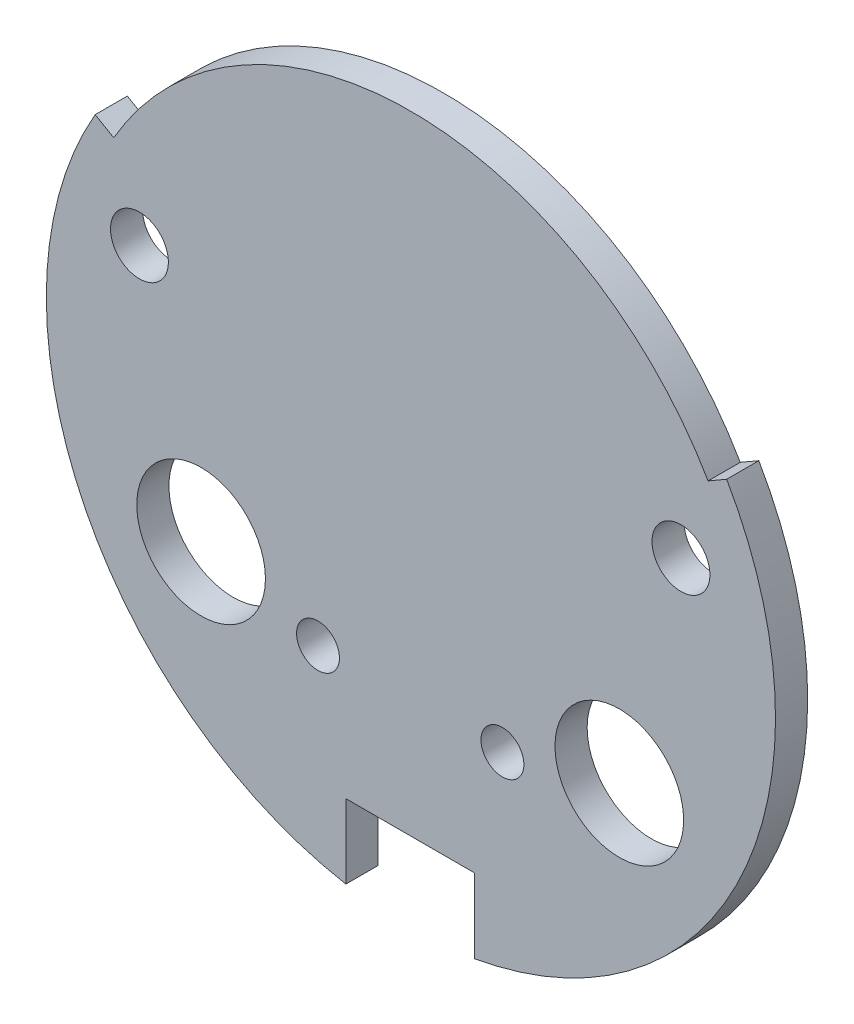
ISO-10303-21;
HEADER;
FILE_DESCRIPTION(('STEP AP214'),'2;1');
FILE_NAME('part.step','',(''),(''),'','','');
FILE_SCHEMA(('AUTOMOTIVE_DESIGN { 1 0 10303 214 1 1 1 1 }'));
ENDSEC;
DATA;
#1=APPLICATION_CONTEXT('core data for automotive mechanical design processes');
#2=APPLICATION_PROTOCOL_DEFINITION('international standard','automotive_design',2000,#1);
#3=PRODUCT_CONTEXT('',#1,'mechanical');
#4=PRODUCT('Part','Part','',(#3));
#5=PRODUCT_RELATED_PRODUCT_CATEGORY('part','',(#4));
#6=PRODUCT_DEFINITION_FORMATION('','',#4);
#7=PRODUCT_DEFINITION_CONTEXT('part definition',#1,'design');
#8=PRODUCT_DEFINITION('design','',#6,#7);
#9=PRODUCT_DEFINITION_SHAPE('','',#8);
#10=(LENGTH_UNIT() NAMED_UNIT(*) SI_UNIT(.MILLI.,.METRE.));
#11=(NAMED_UNIT(*) PLANE_ANGLE_UNIT() SI_UNIT($,.RADIAN.));
#12=(NAMED_UNIT(*) SI_UNIT($,.STERADIAN.) SOLID_ANGLE_UNIT());
#13=UNCERTAINTY_MEASURE_WITH_UNIT(LENGTH_MEASURE(1.E-05),#10,'distance_accuracy_value','');
#14=(GEOMETRIC_REPRESENTATION_CONTEXT(3) GLOBAL_UNCERTAINTY_ASSIGNED_CONTEXT((#13)) GLOBAL_UNIT_ASSIGNED_CONTEXT((#10,
#11,#12)) REPRESENTATION_CONTEXT('',''));
#15=CARTESIAN_POINT('',(0.,0.,0.));
#16=DIRECTION('',(0.,0.,1.));
#17=DIRECTION('',(1.,0.,0.));
#18=AXIS2_PLACEMENT_3D('',#15,#16,#17);
#19=CARTESIAN_POINT('',(2.64771409282375,-12.4645216723403,1.5));
#20=DIRECTION('',(1.,0.,0.));
#21=DIRECTION('',(0.,0.,-1.));
#22=AXIS2_PLACEMENT_3D('',#19,#20,#21);
#23=PLANE('',#22);
#24=DIRECTION('',(0.,-1.,0.));
#25=VECTOR('',#24,1.);
#26=CARTESIAN_POINT('',(2.64771409282375,-12.4645216723403,0.));
#27=LINE('',#26,#25);
#28=CARTESIAN_POINT('',(2.64771409282375,-12.4645216723403,0.));
#29=VERTEX_POINT('',#28);
#30=CARTESIAN_POINT('',(2.64771409282375,-15.9286503754711,0.));
#31=VERTEX_POINT('',#30);
#32=EDGE_CURVE('E131',#29,#31,#27,.T.);
#33=ORIENTED_EDGE('',*,*,#32,.T.);
#34=DIRECTION('',(0.,0.,-1.));
#35=VECTOR('',#34,1.);
#36=CARTESIAN_POINT('',(2.64771409282375,-15.9286503754711,1.5));
#37=LINE('',#36,#35);
#38=CARTESIAN_POINT('',(2.64771409282375,-15.9286503754711,1.5));
#39=VERTEX_POINT('',#38);
#40=EDGE_CURVE('E11',#39,#31,#37,.T.);
#41=ORIENTED_EDGE('',*,*,#40,.F.);
#42=DIRECTION('',(0.,-1.,0.));
#43=VECTOR('',#42,1.);
#44=CARTESIAN_POINT('',(2.64771409282375,-12.4645216723403,1.5));
#45=LINE('',#44,#43);
#46=CARTESIAN_POINT('',(2.64771409282375,-12.4645216723403,1.5));
#47=VERTEX_POINT('',#46);
#48=EDGE_CURVE('E146',#47,#39,#45,.T.);
#49=ORIENTED_EDGE('',*,*,#48,.F.);
#50=DIRECTION('',(0.,0.,-1.));
#51=VECTOR('',#50,1.);
#52=CARTESIAN_POINT('',(2.64771409282375,-12.4645216723403,1.5));
#53=LINE('',#52,#51);
#54=EDGE_CURVE('E127',#47,#29,#53,.T.);
#55=ORIENTED_EDGE('',*,*,#54,.T.);
#56=EDGE_LOOP('',(#33,#41,#49,#55));
#57=FACE_BOUND('',#56,.T.);
#58=ADVANCED_FACE('F35',(#57),#23,.F.);
#59=CARTESIAN_POINT('',(-0.319029957481509,0.810478327659741,1.5));
#60=DIRECTION('',(0.,0.,-1.));
#61=DIRECTION('',(-1.,0.,0.));
#62=AXIS2_PLACEMENT_3D('',#59,#60,#61);
#63=CYLINDRICAL_SURFACE('',#62,17.);
#64=CARTESIAN_POINT('',(-0.319029957481509,0.810478327659741,0.));
#65=DIRECTION('',(0.,0.,1.));
#66=DIRECTION('',(1.,0.,0.));
#67=AXIS2_PLACEMENT_3D('',#64,#65,#66);
#68=CIRCLE('',#67,17.);
#69=CARTESIAN_POINT('',(14.403401906854,9.31047832765971,0.));
#70=VERTEX_POINT('',#69);
#71=EDGE_CURVE('E134',#31,#70,#68,.T.);
#72=ORIENTED_EDGE('',*,*,#71,.T.);
#73=DIRECTION('',(0.,0.,-1.));
#74=VECTOR('',#73,1.);
#75=CARTESIAN_POINT('',(14.403401906854,9.31047832765971,1.5));
#76=LINE('',#75,#74);
#77=CARTESIAN_POINT('',(14.403401906854,9.31047832765971,1.5));
#78=VERTEX_POINT('',#77);
#79=EDGE_CURVE('E43',#78,#70,#76,.T.);
#80=ORIENTED_EDGE('',*,*,#79,.F.);
#81=CARTESIAN_POINT('',(-0.319029957481509,0.810478327659741,1.5));
#82=DIRECTION('',(0.,0.,1.));
#83=DIRECTION('',(1.,0.,0.));
#84=AXIS2_PLACEMENT_3D('',#81,#82,#83);
#85=CIRCLE('',#84,17.);
#86=EDGE_CURVE('E94',#39,#78,#85,.T.);
#87=ORIENTED_EDGE('',*,*,#86,.F.);
#88=ORIENTED_EDGE('',*,*,#40,.T.);
#89=EDGE_LOOP('',(#72,#80,#87,#88));
#90=FACE_BOUND('',#89,.T.);
#91=ADVANCED_FACE('F253',(#90),#63,.T.);
#92=CARTESIAN_POINT('',(14.403401906854,9.31047832765971,1.5));
#93=DIRECTION('',(0.499999999999997,-0.866025403784441,0.));
#94=DIRECTION('',(0.866025403784441,0.499999999999997,0.));
#95=AXIS2_PLACEMENT_3D('',#92,#93,#94);
#96=PLANE('',#95);
#97=DIRECTION('',(-0.86602540378444,-0.499999999999997,0.));
#98=VECTOR('',#97,1.);
#99=CARTESIAN_POINT('',(14.403401906854,9.31047832765971,0.));
#100=LINE('',#99,#98);
#101=CARTESIAN_POINT('',(13.5373765030695,8.81047832765971,0.));
#102=VERTEX_POINT('',#101);
#103=EDGE_CURVE('E137',#70,#102,#100,.T.);
#104=ORIENTED_EDGE('',*,*,#103,.T.);
#105=DIRECTION('',(0.,0.,-1.));
#106=VECTOR('',#105,1.);
#107=CARTESIAN_POINT('',(13.5373765030695,8.81047832765971,1.5));
#108=LINE('',#107,#106);
#109=CARTESIAN_POINT('',(13.5373765030695,8.81047832765971,1.5));
#110=VERTEX_POINT('',#109);
#111=EDGE_CURVE('E153',#110,#102,#108,.T.);
#112=ORIENTED_EDGE('',*,*,#111,.F.);
#113=DIRECTION('',(-0.86602540378444,-0.499999999999997,0.));
#114=VECTOR('',#113,1.);
#115=CARTESIAN_POINT('',(14.403401906854,9.31047832765971,1.5));
#116=LINE('',#115,#114);
#117=EDGE_CURVE('E161',#78,#110,#116,.T.);
#118=ORIENTED_EDGE('',*,*,#117,.F.);
#119=ORIENTED_EDGE('',*,*,#79,.T.);
#120=EDGE_LOOP('',(#104,#112,#118,#119));
#121=FACE_BOUND('',#120,.T.);
#122=ADVANCED_FACE('F159',(#121),#96,.F.);
#123=CARTESIAN_POINT('',(-0.319029957481509,0.810478327659741,1.5));
#124=DIRECTION('',(0.,0.,-1.));
#125=DIRECTION('',(-1.,0.,0.));
#126=AXIS2_PLACEMENT_3D('',#123,#124,#125);
#127=CYLINDRICAL_SURFACE('',#126,16.);
#128=CARTESIAN_POINT('',(-0.319029957481509,0.810478327659741,0.));
#129=DIRECTION('',(0.,0.,1.));
#130=DIRECTION('',(1.,0.,0.));
#131=AXIS2_PLACEMENT_3D('',#128,#129,#130);
#132=CIRCLE('',#131,16.);
#133=CARTESIAN_POINT('',(-14.1754364180326,8.8104783276597,0.));
#134=VERTEX_POINT('',#133);
#135=EDGE_CURVE('E139',#102,#134,#132,.T.);
#136=ORIENTED_EDGE('',*,*,#135,.T.);
#137=DIRECTION('',(0.,0.,-1.));
#138=VECTOR('',#137,1.);
#139=CARTESIAN_POINT('',(-14.1754364180326,8.8104783276597,1.5));
#140=LINE('',#139,#138);
#141=CARTESIAN_POINT('',(-14.1754364180326,8.8104783276597,1.5));
#142=VERTEX_POINT('',#141);
#143=EDGE_CURVE('E150',#142,#134,#140,.T.);
#144=ORIENTED_EDGE('',*,*,#143,.F.);
#145=CARTESIAN_POINT('',(-0.319029957481509,0.810478327659741,1.5));
#146=DIRECTION('',(0.,0.,1.));
#147=DIRECTION('',(1.,0.,0.));
#148=AXIS2_PLACEMENT_3D('',#145,#146,#147);
#149=CIRCLE('',#148,16.);
#150=EDGE_CURVE('E173',#110,#142,#149,.T.);
#151=ORIENTED_EDGE('',*,*,#150,.F.);
#152=ORIENTED_EDGE('',*,*,#111,.T.);
#153=EDGE_LOOP('',(#136,#144,#151,#152));
#154=FACE_BOUND('',#153,.T.);
#155=ADVANCED_FACE('F169',(#154),#127,.T.);
#156=CARTESIAN_POINT('',(-14.1754364180326,8.8104783276597,1.5));
#157=DIRECTION('',(-0.500000000000001,-0.866025403784438,0.));
#158=DIRECTION('',(0.866025403784438,-0.500000000000001,0.));
#159=AXIS2_PLACEMENT_3D('',#156,#157,#158);
#160=PLANE('',#159);
#161=DIRECTION('',(-0.866025403784438,0.500000000000001,0.));
#162=VECTOR('',#161,1.);
#163=CARTESIAN_POINT('',(-14.1754364180326,8.8104783276597,0.));
#164=LINE('',#163,#162);
#165=CARTESIAN_POINT('',(-15.041461821817,9.3104783276597,0.));
#166=VERTEX_POINT('',#165);
#167=EDGE_CURVE('E141',#134,#166,#164,.T.);
#168=ORIENTED_EDGE('',*,*,#167,.T.);
#169=DIRECTION('',(0.,0.,-1.));
#170=VECTOR('',#169,1.);
#171=CARTESIAN_POINT('',(-15.041461821817,9.3104783276597,1.5));
#172=LINE('',#171,#170);
#173=CARTESIAN_POINT('',(-15.041461821817,9.3104783276597,1.5));
#174=VERTEX_POINT('',#173);
#175=EDGE_CURVE('E122',#174,#166,#172,.T.);
#176=ORIENTED_EDGE('',*,*,#175,.F.);
#177=DIRECTION('',(-0.866025403784438,0.500000000000001,0.));
#178=VECTOR('',#177,1.);
#179=CARTESIAN_POINT('',(-14.1754364180326,8.8104783276597,1.5));
#180=LINE('',#179,#178);
#181=EDGE_CURVE('E113',#142,#174,#180,.T.);
#182=ORIENTED_EDGE('',*,*,#181,.F.);
#183=ORIENTED_EDGE('',*,*,#143,.T.);
#184=EDGE_LOOP('',(#168,#176,#182,#183));
#185=FACE_BOUND('',#184,.T.);
#186=ADVANCED_FACE('F172',(#185),#160,.F.);
#187=CARTESIAN_POINT('',(-0.319029957481509,0.810478327659741,1.5));
#188=DIRECTION('',(0.,0.,-1.));
#189=DIRECTION('',(-1.,0.,0.));
#190=AXIS2_PLACEMENT_3D('',#187,#188,#189);
#191=CYLINDRICAL_SURFACE('',#190,17.);
#192=CARTESIAN_POINT('',(-0.319029957481509,0.810478327659741,0.));
#193=DIRECTION('',(0.,0.,1.));
#194=DIRECTION('',(1.,0.,0.));
#195=AXIS2_PLACEMENT_3D('',#192,#193,#194);
#196=CIRCLE('',#195,17.);
#197=CARTESIAN_POINT('',(-3.35228590717625,-15.9167258124122,0.));
#198=VERTEX_POINT('',#197);
#199=EDGE_CURVE('E121',#166,#198,#196,.T.);
#200=ORIENTED_EDGE('',*,*,#199,.T.);
#201=DIRECTION('',(0.,0.,-1.));
#202=VECTOR('',#201,1.);
#203=CARTESIAN_POINT('',(-3.35228590717625,-15.9167258124122,1.5));
#204=LINE('',#203,#202);
#205=CARTESIAN_POINT('',(-3.35228590717625,-15.9167258124122,1.5));
#206=VERTEX_POINT('',#205);
#207=EDGE_CURVE('E118',#206,#198,#204,.T.);
#208=ORIENTED_EDGE('',*,*,#207,.F.);
#209=CARTESIAN_POINT('',(-0.319029957481509,0.810478327659741,1.5));
#210=DIRECTION('',(0.,0.,1.));
#211=DIRECTION('',(1.,0.,0.));
#212=AXIS2_PLACEMENT_3D('',#209,#210,#211);
#213=CIRCLE('',#212,17.);
#214=EDGE_CURVE('E107',#174,#206,#213,.T.);
#215=ORIENTED_EDGE('',*,*,#214,.F.);
#216=ORIENTED_EDGE('',*,*,#175,.T.);
#217=EDGE_LOOP('',(#200,#208,#215,#216));
#218=FACE_BOUND('',#217,.T.);
#219=ADVANCED_FACE('F119',(#218),#191,.T.);
#220=CARTESIAN_POINT('',(-3.35228590717625,-12.4645216723403,1.5));
#221=DIRECTION('',(-1.,0.,0.));
#222=DIRECTION('',(0.,0.,1.));
#223=AXIS2_PLACEMENT_3D('',#220,#221,#222);
#224=PLANE('',#223);
#225=DIRECTION('',(0.,1.,0.));
#226=VECTOR('',#225,1.);
#227=CARTESIAN_POINT('',(-3.35228590717625,-12.4645216723403,0.));
#228=LINE('',#227,#226);
#229=CARTESIAN_POINT('',(-3.35228590717625,-12.4645216723403,0.));
#230=VERTEX_POINT('',#229);
#231=EDGE_CURVE('E80',#198,#230,#228,.T.);
#232=ORIENTED_EDGE('',*,*,#231,.T.);
#233=DIRECTION('',(0.,0.,-1.));
#234=VECTOR('',#233,1.);
#235=CARTESIAN_POINT('',(-3.35228590717625,-12.4645216723403,1.5));
#236=LINE('',#235,#234);
#237=CARTESIAN_POINT('',(-3.35228590717625,-12.4645216723403,1.5));
#238=VERTEX_POINT('',#237);
#239=EDGE_CURVE('E123',#238,#230,#236,.T.);
#240=ORIENTED_EDGE('',*,*,#239,.F.);
#241=DIRECTION('',(0.,1.,0.));
#242=VECTOR('',#241,1.);
#243=CARTESIAN_POINT('',(-3.35228590717625,-12.4645216723403,1.5));
#244=LINE('',#243,#242);
#245=EDGE_CURVE('E111',#206,#238,#244,.T.);
#246=ORIENTED_EDGE('',*,*,#245,.F.);
#247=ORIENTED_EDGE('',*,*,#207,.T.);
#248=EDGE_LOOP('',(#232,#240,#246,#247));
#249=FACE_BOUND('',#248,.T.);
#250=ADVANCED_FACE('F125',(#249),#224,.F.);
#251=CARTESIAN_POINT('',(-3.35228590717625,-12.4645216723403,1.5));
#252=DIRECTION('',(0.,1.,0.));
#253=DIRECTION('',(0.,0.,1.));
#254=AXIS2_PLACEMENT_3D('',#251,#252,#253);
#255=PLANE('',#254);
#256=DIRECTION('',(1.,0.,0.));
#257=VECTOR('',#256,1.);
#258=CARTESIAN_POINT('',(-3.35228590717625,-12.4645216723403,0.));
#259=LINE('',#258,#257);
#260=EDGE_CURVE('E86',#230,#29,#259,.T.);
#261=ORIENTED_EDGE('',*,*,#260,.T.);
#262=ORIENTED_EDGE('',*,*,#54,.F.);
#263=DIRECTION('',(1.,0.,0.));
#264=VECTOR('',#263,1.);
#265=CARTESIAN_POINT('',(-3.35228590717625,-12.4645216723403,1.5));
#266=LINE('',#265,#264);
#267=EDGE_CURVE('E51',#238,#47,#266,.T.);
#268=ORIENTED_EDGE('',*,*,#267,.F.);
#269=ORIENTED_EDGE('',*,*,#239,.T.);
#270=EDGE_LOOP('',(#261,#262,#268,#269));
#271=FACE_BOUND('',#270,.T.);
#272=ADVANCED_FACE('F226',(#271),#255,.F.);
#273=CARTESIAN_POINT('',(-0.319029957481509,0.810478327659741,1.5));
#274=DIRECTION('',(0.,0.,1.));
#275=DIRECTION('',(1.,0.,0.));
#276=AXIS2_PLACEMENT_3D('',#273,#274,#275);
#277=PLANE('',#276);
#278=CARTESIAN_POINT('',(3.94771409282375,-6.93952167234026,1.5));
#279=DIRECTION('',(0.,0.,1.));
#280=DIRECTION('',(-1.,0.,0.));
#281=AXIS2_PLACEMENT_3D('',#278,#279,#280);
#282=CIRCLE('',#281,1.);
#283=CARTESIAN_POINT('',(2.94771409282375,-6.93952167234026,1.5));
#284=VERTEX_POINT('',#283);
#285=EDGE_CURVE('E209',#284,#284,#282,.T.);
#286=ORIENTED_EDGE('',*,*,#285,.F.);
#287=EDGE_LOOP('',(#286));
#288=FACE_BOUND('',#287,.T.);
#289=CARTESIAN_POINT('',(-4.65228590717625,-6.93952167234026,1.5));
#290=DIRECTION('',(0.,0.,1.));
#291=DIRECTION('',(1.,0.,0.));
#292=AXIS2_PLACEMENT_3D('',#289,#290,#291);
#293=CIRCLE('',#292,1.);
#294=CARTESIAN_POINT('',(-3.65228590717625,-6.93952167234026,1.5));
#295=VERTEX_POINT('',#294);
#296=EDGE_CURVE('E203',#295,#295,#293,.T.);
#297=ORIENTED_EDGE('',*,*,#296,.F.);
#298=EDGE_LOOP('',(#297));
#299=FACE_BOUND('',#298,.T.);
#300=CARTESIAN_POINT('',(12.2727140928238,5.06047832765974,1.5));
#301=DIRECTION('',(0.,0.,1.));
#302=DIRECTION('',(-1.,0.,0.));
#303=AXIS2_PLACEMENT_3D('',#300,#301,#302);
#304=CIRCLE('',#303,1.35);
#305=CARTESIAN_POINT('',(10.9227140928238,5.06047832765974,1.5));
#306=VERTEX_POINT('',#305);
#307=EDGE_CURVE('E197',#306,#306,#304,.T.);
#308=ORIENTED_EDGE('',*,*,#307,.F.);
#309=EDGE_LOOP('',(#308));
#310=FACE_BOUND('',#309,.T.);
#311=CARTESIAN_POINT('',(-12.9772859071762,5.06047832765974,1.5));
#312=DIRECTION('',(0.,0.,1.));
#313=DIRECTION('',(1.,0.,0.));
#314=AXIS2_PLACEMENT_3D('',#311,#312,#313);
#315=CIRCLE('',#314,1.35);
#316=CARTESIAN_POINT('',(-11.6272859071762,5.06047832765974,1.5));
#317=VERTEX_POINT('',#316);
#318=EDGE_CURVE('E191',#317,#317,#315,.T.);
#319=ORIENTED_EDGE('',*,*,#318,.F.);
#320=EDGE_LOOP('',(#319));
#321=FACE_BOUND('',#320,.T.);
#322=CARTESIAN_POINT('',(9.39771409282375,-5.46452167234026,1.5));
#323=DIRECTION('',(0.,0.,1.));
#324=DIRECTION('',(-1.,0.,0.));
#325=AXIS2_PLACEMENT_3D('',#322,#323,#324);
#326=CIRCLE('',#325,3.);
#327=CARTESIAN_POINT('',(6.39771409282375,-5.46452167234026,1.5));
#328=VERTEX_POINT('',#327);
#329=EDGE_CURVE('E185',#328,#328,#326,.T.);
#330=ORIENTED_EDGE('',*,*,#329,.F.);
#331=EDGE_LOOP('',(#330));
#332=FACE_BOUND('',#331,.T.);
#333=CARTESIAN_POINT('',(-10.1022859071762,-5.46452167234026,1.5));
#334=DIRECTION('',(0.,0.,1.));
#335=DIRECTION('',(1.,0.,0.));
#336=AXIS2_PLACEMENT_3D('',#333,#334,#335);
#337=CIRCLE('',#336,3.);
#338=CARTESIAN_POINT('',(-7.10228590717625,-5.46452167234026,1.5));
#339=VERTEX_POINT('',#338);
#340=EDGE_CURVE('E179',#339,#339,#337,.T.);
#341=ORIENTED_EDGE('',*,*,#340,.F.);
#342=EDGE_LOOP('',(#341));
#343=FACE_BOUND('',#342,.T.);
#344=ORIENTED_EDGE('',*,*,#48,.T.);
#345=ORIENTED_EDGE('',*,*,#86,.T.);
#346=ORIENTED_EDGE('',*,*,#117,.T.);
#347=ORIENTED_EDGE('',*,*,#150,.T.);
#348=ORIENTED_EDGE('',*,*,#181,.T.);
#349=ORIENTED_EDGE('',*,*,#214,.T.);
#350=ORIENTED_EDGE('',*,*,#245,.T.);
#351=ORIENTED_EDGE('',*,*,#267,.T.);
#352=EDGE_LOOP('',(#344,#345,#346,#347,#348,#349,#350,#351));
#353=FACE_BOUND('',#352,.T.);
#354=ADVANCED_FACE('F109',(#288,#299,#310,#321,#332,#343,#353),#277,.T.);
#355=CARTESIAN_POINT('',(-0.319029957481509,0.810478327659741,0.));
#356=DIRECTION('',(0.,0.,1.));
#357=DIRECTION('',(1.,0.,0.));
#358=AXIS2_PLACEMENT_3D('',#355,#356,#357);
#359=PLANE('',#358);
#360=CARTESIAN_POINT('',(3.94771409282375,-6.93952167234026,0.));
#361=DIRECTION('',(0.,0.,1.));
#362=DIRECTION('',(-1.,0.,0.));
#363=AXIS2_PLACEMENT_3D('',#360,#361,#362);
#364=CIRCLE('',#363,1.);
#365=CARTESIAN_POINT('',(2.94771409282375,-6.93952167234026,0.));
#366=VERTEX_POINT('',#365);
#367=EDGE_CURVE('E206',#366,#366,#364,.T.);
#368=ORIENTED_EDGE('',*,*,#367,.T.);
#369=EDGE_LOOP('',(#368));
#370=FACE_BOUND('',#369,.T.);
#371=CARTESIAN_POINT('',(-4.65228590717625,-6.93952167234026,0.));
#372=DIRECTION('',(0.,0.,1.));
#373=DIRECTION('',(1.,0.,0.));
#374=AXIS2_PLACEMENT_3D('',#371,#372,#373);
#375=CIRCLE('',#374,1.);
#376=CARTESIAN_POINT('',(-3.65228590717625,-6.93952167234026,0.));
#377=VERTEX_POINT('',#376);
#378=EDGE_CURVE('E200',#377,#377,#375,.T.);
#379=ORIENTED_EDGE('',*,*,#378,.T.);
#380=EDGE_LOOP('',(#379));
#381=FACE_BOUND('',#380,.T.);
#382=CARTESIAN_POINT('',(12.2727140928238,5.06047832765974,0.));
#383=DIRECTION('',(0.,0.,1.));
#384=DIRECTION('',(-1.,0.,0.));
#385=AXIS2_PLACEMENT_3D('',#382,#383,#384);
#386=CIRCLE('',#385,1.35);
#387=CARTESIAN_POINT('',(10.9227140928238,5.06047832765974,0.));
#388=VERTEX_POINT('',#387);
#389=EDGE_CURVE('E194',#388,#388,#386,.T.);
#390=ORIENTED_EDGE('',*,*,#389,.T.);
#391=EDGE_LOOP('',(#390));
#392=FACE_BOUND('',#391,.T.);
#393=CARTESIAN_POINT('',(-12.9772859071762,5.06047832765974,0.));
#394=DIRECTION('',(0.,0.,1.));
#395=DIRECTION('',(1.,0.,0.));
#396=AXIS2_PLACEMENT_3D('',#393,#394,#395);
#397=CIRCLE('',#396,1.35);
#398=CARTESIAN_POINT('',(-11.6272859071762,5.06047832765974,0.));
#399=VERTEX_POINT('',#398);
#400=EDGE_CURVE('E188',#399,#399,#397,.T.);
#401=ORIENTED_EDGE('',*,*,#400,.T.);
#402=EDGE_LOOP('',(#401));
#403=FACE_BOUND('',#402,.T.);
#404=CARTESIAN_POINT('',(9.39771409282375,-5.46452167234026,0.));
#405=DIRECTION('',(0.,0.,1.));
#406=DIRECTION('',(-1.,0.,0.));
#407=AXIS2_PLACEMENT_3D('',#404,#405,#406);
#408=CIRCLE('',#407,3.);
#409=CARTESIAN_POINT('',(6.39771409282375,-5.46452167234026,0.));
#410=VERTEX_POINT('',#409);
#411=EDGE_CURVE('E182',#410,#410,#408,.T.);
#412=ORIENTED_EDGE('',*,*,#411,.T.);
#413=EDGE_LOOP('',(#412));
#414=FACE_BOUND('',#413,.T.);
#415=CARTESIAN_POINT('',(-10.1022859071762,-5.46452167234026,0.));
#416=DIRECTION('',(0.,0.,1.));
#417=DIRECTION('',(1.,0.,0.));
#418=AXIS2_PLACEMENT_3D('',#415,#416,#417);
#419=CIRCLE('',#418,3.);
#420=CARTESIAN_POINT('',(-7.10228590717625,-5.46452167234026,0.));
#421=VERTEX_POINT('',#420);
#422=EDGE_CURVE('E135',#421,#421,#419,.T.);
#423=ORIENTED_EDGE('',*,*,#422,.T.);
#424=EDGE_LOOP('',(#423));
#425=FACE_BOUND('',#424,.T.);
#426=ORIENTED_EDGE('',*,*,#32,.F.);
#427=ORIENTED_EDGE('',*,*,#260,.F.);
#428=ORIENTED_EDGE('',*,*,#231,.F.);
#429=ORIENTED_EDGE('',*,*,#199,.F.);
#430=ORIENTED_EDGE('',*,*,#167,.F.);
#431=ORIENTED_EDGE('',*,*,#135,.F.);
#432=ORIENTED_EDGE('',*,*,#103,.F.);
#433=ORIENTED_EDGE('',*,*,#71,.F.);
#434=EDGE_LOOP('',(#426,#427,#428,#429,#430,#431,#432,#433));
#435=FACE_BOUND('',#434,.T.);
#436=ADVANCED_FACE('F165',(#370,#381,#392,#403,#414,#425,#435),#359,.F.);
#437=CARTESIAN_POINT('',(-10.1022859071762,-5.46452167234026,0.));
#438=DIRECTION('',(0.,0.,1.));
#439=DIRECTION('',(1.,0.,0.));
#440=AXIS2_PLACEMENT_3D('',#437,#438,#439);
#441=CYLINDRICAL_SURFACE('',#440,3.);
#442=ORIENTED_EDGE('',*,*,#422,.F.);
#443=EDGE_LOOP('',(#442));
#444=FACE_BOUND('',#443,.T.);
#445=ORIENTED_EDGE('',*,*,#340,.T.);
#446=EDGE_LOOP('',(#445));
#447=FACE_BOUND('',#446,.T.);
#448=ADVANCED_FACE('F238',(#444,#447),#441,.F.);
#449=CARTESIAN_POINT('',(9.39771409282375,-5.46452167234026,0.));
#450=DIRECTION('',(0.,0.,1.));
#451=DIRECTION('',(1.,0.,0.));
#452=AXIS2_PLACEMENT_3D('',#449,#450,#451);
#453=CYLINDRICAL_SURFACE('',#452,3.);
#454=ORIENTED_EDGE('',*,*,#411,.F.);
#455=EDGE_LOOP('',(#454));
#456=FACE_BOUND('',#455,.T.);
#457=ORIENTED_EDGE('',*,*,#329,.T.);
#458=EDGE_LOOP('',(#457));
#459=FACE_BOUND('',#458,.T.);
#460=ADVANCED_FACE('F240',(#456,#459),#453,.F.);
#461=CARTESIAN_POINT('',(-12.9772859071762,5.06047832765974,0.));
#462=DIRECTION('',(0.,0.,1.));
#463=DIRECTION('',(1.,0.,0.));
#464=AXIS2_PLACEMENT_3D('',#461,#462,#463);
#465=CYLINDRICAL_SURFACE('',#464,1.35);
#466=ORIENTED_EDGE('',*,*,#400,.F.);
#467=EDGE_LOOP('',(#466));
#468=FACE_BOUND('',#467,.T.);
#469=ORIENTED_EDGE('',*,*,#318,.T.);
#470=EDGE_LOOP('',(#469));
#471=FACE_BOUND('',#470,.T.);
#472=ADVANCED_FACE('F247',(#468,#471),#465,.F.);
#473=CARTESIAN_POINT('',(12.2727140928238,5.06047832765974,0.));
#474=DIRECTION('',(0.,0.,1.));
#475=DIRECTION('',(1.,0.,0.));
#476=AXIS2_PLACEMENT_3D('',#473,#474,#475);
#477=CYLINDRICAL_SURFACE('',#476,1.35);
#478=ORIENTED_EDGE('',*,*,#389,.F.);
#479=EDGE_LOOP('',(#478));
#480=FACE_BOUND('',#479,.T.);
#481=ORIENTED_EDGE('',*,*,#307,.T.);
#482=EDGE_LOOP('',(#481));
#483=FACE_BOUND('',#482,.T.);
#484=ADVANCED_FACE('F329',(#480,#483),#477,.F.);
#485=CARTESIAN_POINT('',(-4.65228590717625,-6.93952167234026,0.));
#486=DIRECTION('',(0.,0.,1.));
#487=DIRECTION('',(1.,0.,0.));
#488=AXIS2_PLACEMENT_3D('',#485,#486,#487);
#489=CYLINDRICAL_SURFACE('',#488,1.);
#490=ORIENTED_EDGE('',*,*,#378,.F.);
#491=EDGE_LOOP('',(#490));
#492=FACE_BOUND('',#491,.T.);
#493=ORIENTED_EDGE('',*,*,#296,.T.);
#494=EDGE_LOOP('',(#493));
#495=FACE_BOUND('',#494,.T.);
#496=ADVANCED_FACE('F220',(#492,#495),#489,.F.);
#497=CARTESIAN_POINT('',(3.94771409282375,-6.93952167234026,0.));
#498=DIRECTION('',(0.,0.,1.));
#499=DIRECTION('',(1.,0.,0.));
#500=AXIS2_PLACEMENT_3D('',#497,#498,#499);
#501=CYLINDRICAL_SURFACE('',#500,1.);
#502=ORIENTED_EDGE('',*,*,#367,.F.);
#503=EDGE_LOOP('',(#502));
#504=FACE_BOUND('',#503,.T.);
#505=ORIENTED_EDGE('',*,*,#285,.T.);
#506=EDGE_LOOP('',(#505));
#507=FACE_BOUND('',#506,.T.);
#508=ADVANCED_FACE('F217',(#504,#507),#501,.F.);
#509=CLOSED_SHELL('',(#58,#91,#122,#155,#186,#219,#250,#272,#354,#436,#448,#460,#472,#484,#496,#508));
#510=MANIFOLD_SOLID_BREP('B2',#509);
#511=ADVANCED_BREP_SHAPE_REPRESENTATION('',(#18,#510),#14);
#512=SHAPE_DEFINITION_REPRESENTATION(#9,#511);
ENDSEC;
END-ISO-10303-21;
